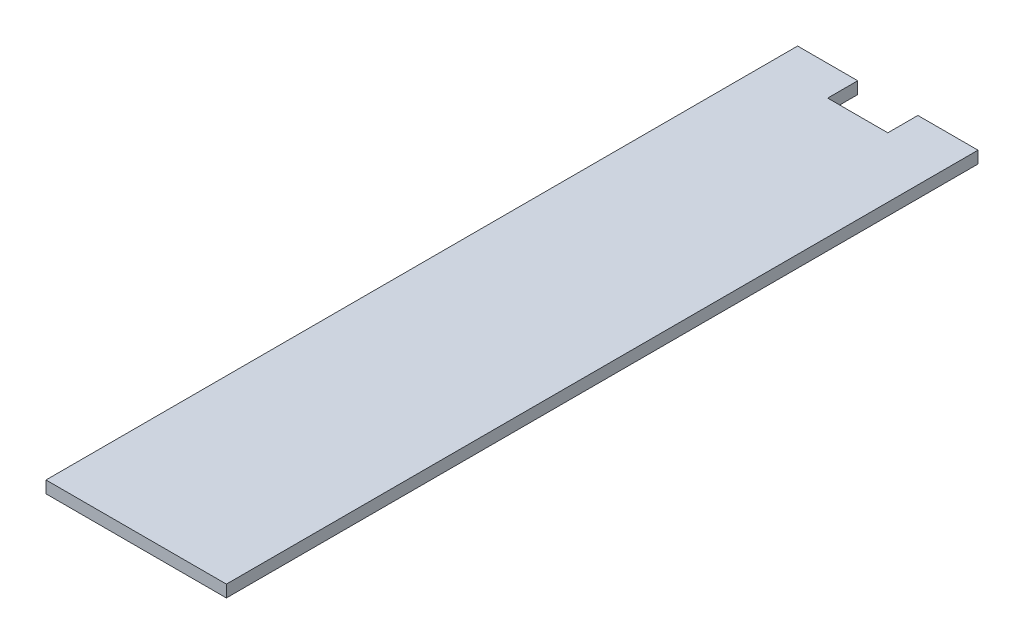
ISO-10303-21;
HEADER;
FILE_DESCRIPTION(('STEP AP214'),'2;1');
FILE_NAME('part.step','',(''),(''),'','','');
FILE_SCHEMA(('AUTOMOTIVE_DESIGN { 1 0 10303 214 1 1 1 1 }'));
ENDSEC;
DATA;
#1=APPLICATION_CONTEXT('core data for automotive mechanical design processes');
#2=APPLICATION_PROTOCOL_DEFINITION('international standard','automotive_design',2000,#1);
#3=PRODUCT_CONTEXT('',#1,'mechanical');
#4=PRODUCT('Part','Part','',(#3));
#5=PRODUCT_RELATED_PRODUCT_CATEGORY('part','',(#4));
#6=PRODUCT_DEFINITION_FORMATION('','',#4);
#7=PRODUCT_DEFINITION_CONTEXT('part definition',#1,'design');
#8=PRODUCT_DEFINITION('design','',#6,#7);
#9=PRODUCT_DEFINITION_SHAPE('','',#8);
#10=(LENGTH_UNIT() NAMED_UNIT(*) SI_UNIT(.MILLI.,.METRE.));
#11=(NAMED_UNIT(*) PLANE_ANGLE_UNIT() SI_UNIT($,.RADIAN.));
#12=(NAMED_UNIT(*) SI_UNIT($,.STERADIAN.) SOLID_ANGLE_UNIT());
#13=UNCERTAINTY_MEASURE_WITH_UNIT(LENGTH_MEASURE(1.E-05),#10,'distance_accuracy_value','');
#14=(GEOMETRIC_REPRESENTATION_CONTEXT(3) GLOBAL_UNCERTAINTY_ASSIGNED_CONTEXT((#13)) GLOBAL_UNIT_ASSIGNED_CONTEXT((#10,
#11,#12)) REPRESENTATION_CONTEXT('',''));
#15=CARTESIAN_POINT('',(0.,0.,0.));
#16=DIRECTION('',(0.,0.,1.));
#17=DIRECTION('',(1.,0.,0.));
#18=AXIS2_PLACEMENT_3D('',#15,#16,#17);
#19=CARTESIAN_POINT('',(0.,2.54,0.));
#20=DIRECTION('',(0.,0.,-1.));
#21=DIRECTION('',(-1.,0.,0.));
#22=AXIS2_PLACEMENT_3D('',#19,#20,#21);
#23=PLANE('',#22);
#24=DIRECTION('',(1.,0.,0.));
#25=VECTOR('',#24,1.);
#26=CARTESIAN_POINT('',(0.,0.,0.));
#27=LINE('',#26,#25);
#28=CARTESIAN_POINT('',(0.,0.,0.));
#29=VERTEX_POINT('',#28);
#30=CARTESIAN_POINT('',(38.1,0.,0.));
#31=VERTEX_POINT('',#30);
#32=EDGE_CURVE('E132',#29,#31,#27,.T.);
#33=ORIENTED_EDGE('',*,*,#32,.T.);
#34=DIRECTION('',(0.,-1.,0.));
#35=VECTOR('',#34,1.);
#36=CARTESIAN_POINT('',(38.1,2.54,0.));
#37=LINE('',#36,#35);
#38=CARTESIAN_POINT('',(38.1,2.54,0.));
#39=VERTEX_POINT('',#38);
#40=EDGE_CURVE('E11',#39,#31,#37,.T.);
#41=ORIENTED_EDGE('',*,*,#40,.F.);
#42=DIRECTION('',(1.,0.,0.));
#43=VECTOR('',#42,1.);
#44=CARTESIAN_POINT('',(0.,2.54,0.));
#45=LINE('',#44,#43);
#46=CARTESIAN_POINT('',(0.,2.54,0.));
#47=VERTEX_POINT('',#46);
#48=EDGE_CURVE('E151',#47,#39,#45,.T.);
#49=ORIENTED_EDGE('',*,*,#48,.F.);
#50=DIRECTION('',(0.,-1.,0.));
#51=VECTOR('',#50,1.);
#52=CARTESIAN_POINT('',(0.,2.54,0.));
#53=LINE('',#52,#51);
#54=EDGE_CURVE('E51',#47,#29,#53,.T.);
#55=ORIENTED_EDGE('',*,*,#54,.T.);
#56=EDGE_LOOP('',(#33,#41,#49,#55));
#57=FACE_BOUND('',#56,.T.);
#58=ADVANCED_FACE('F35',(#57),#23,.F.);
#59=CARTESIAN_POINT('',(38.1,2.54,0.));
#60=DIRECTION('',(-1.,0.,0.));
#61=DIRECTION('',(0.,0.,1.));
#62=AXIS2_PLACEMENT_3D('',#59,#60,#61);
#63=PLANE('',#62);
#64=DIRECTION('',(0.,0.,-1.));
#65=VECTOR('',#64,1.);
#66=CARTESIAN_POINT('',(38.1,0.,0.));
#67=LINE('',#66,#65);
#68=CARTESIAN_POINT('',(38.1,0.,-158.75));
#69=VERTEX_POINT('',#68);
#70=EDGE_CURVE('E134',#31,#69,#67,.T.);
#71=ORIENTED_EDGE('',*,*,#70,.T.);
#72=DIRECTION('',(0.,-1.,0.));
#73=VECTOR('',#72,1.);
#74=CARTESIAN_POINT('',(38.1,2.54,-158.75));
#75=LINE('',#74,#73);
#76=CARTESIAN_POINT('',(38.1,2.54,-158.75));
#77=VERTEX_POINT('',#76);
#78=EDGE_CURVE('E43',#77,#69,#75,.T.);
#79=ORIENTED_EDGE('',*,*,#78,.F.);
#80=DIRECTION('',(0.,0.,-1.));
#81=VECTOR('',#80,1.);
#82=CARTESIAN_POINT('',(38.1,2.54,0.));
#83=LINE('',#82,#81);
#84=EDGE_CURVE('E89',#39,#77,#83,.T.);
#85=ORIENTED_EDGE('',*,*,#84,.F.);
#86=ORIENTED_EDGE('',*,*,#40,.T.);
#87=EDGE_LOOP('',(#71,#79,#85,#86));
#88=FACE_BOUND('',#87,.T.);
#89=ADVANCED_FACE('F178',(#88),#63,.F.);
#90=CARTESIAN_POINT('',(0.,2.54,-158.75));
#91=DIRECTION('',(0.,0.,1.));
#92=DIRECTION('',(1.,0.,0.));
#93=AXIS2_PLACEMENT_3D('',#90,#91,#92);
#94=PLANE('',#93);
#95=DIRECTION('',(-1.,0.,0.));
#96=VECTOR('',#95,1.);
#97=CARTESIAN_POINT('',(0.,0.,-158.75));
#98=LINE('',#97,#96);
#99=CARTESIAN_POINT('',(25.4,0.,-158.75));
#100=VERTEX_POINT('',#99);
#101=EDGE_CURVE('E136',#69,#100,#98,.T.);
#102=ORIENTED_EDGE('',*,*,#101,.T.);
#103=DIRECTION('',(0.,-1.,0.));
#104=VECTOR('',#103,1.);
#105=CARTESIAN_POINT('',(25.4,2.54,-158.75));
#106=LINE('',#105,#104);
#107=CARTESIAN_POINT('',(25.4,2.54,-158.75));
#108=VERTEX_POINT('',#107);
#109=EDGE_CURVE('E157',#108,#100,#106,.T.);
#110=ORIENTED_EDGE('',*,*,#109,.F.);
#111=DIRECTION('',(-1.,0.,0.));
#112=VECTOR('',#111,1.);
#113=CARTESIAN_POINT('',(0.,2.54,-158.75));
#114=LINE('',#113,#112);
#115=EDGE_CURVE('E164',#77,#108,#114,.T.);
#116=ORIENTED_EDGE('',*,*,#115,.F.);
#117=ORIENTED_EDGE('',*,*,#78,.T.);
#118=EDGE_LOOP('',(#102,#110,#116,#117));
#119=FACE_BOUND('',#118,.T.);
#120=ADVANCED_FACE('F162',(#119),#94,.F.);
#121=CARTESIAN_POINT('',(25.4,2.54,0.));
#122=DIRECTION('',(-1.,0.,0.));
#123=DIRECTION('',(0.,0.,1.));
#124=AXIS2_PLACEMENT_3D('',#121,#122,#123);
#125=PLANE('',#124);
#126=DIRECTION('',(0.,0.,-1.));
#127=VECTOR('',#126,1.);
#128=CARTESIAN_POINT('',(25.4,0.,0.));
#129=LINE('',#128,#127);
#130=CARTESIAN_POINT('',(25.4,0.,-152.4));
#131=VERTEX_POINT('',#130);
#132=EDGE_CURVE('E139',#131,#100,#129,.T.);
#133=ORIENTED_EDGE('',*,*,#132,.F.);
#134=DIRECTION('',(0.,-1.,0.));
#135=VECTOR('',#134,1.);
#136=CARTESIAN_POINT('',(25.4,2.54,-152.4));
#137=LINE('',#136,#135);
#138=CARTESIAN_POINT('',(25.4,2.54,-152.4));
#139=VERTEX_POINT('',#138);
#140=EDGE_CURVE('E155',#139,#131,#137,.T.);
#141=ORIENTED_EDGE('',*,*,#140,.F.);
#142=DIRECTION('',(0.,0.,-1.));
#143=VECTOR('',#142,1.);
#144=CARTESIAN_POINT('',(25.4,2.54,0.));
#145=LINE('',#144,#143);
#146=EDGE_CURVE('E172',#139,#108,#145,.T.);
#147=ORIENTED_EDGE('',*,*,#146,.T.);
#148=ORIENTED_EDGE('',*,*,#109,.T.);
#149=EDGE_LOOP('',(#133,#141,#147,#148));
#150=FACE_BOUND('',#149,.T.);
#151=ADVANCED_FACE('F170',(#150),#125,.T.);
#152=CARTESIAN_POINT('',(0.,2.54,-152.4));
#153=DIRECTION('',(0.,0.,-1.));
#154=DIRECTION('',(-1.,0.,0.));
#155=AXIS2_PLACEMENT_3D('',#152,#153,#154);
#156=PLANE('',#155);
#157=DIRECTION('',(1.,0.,0.));
#158=VECTOR('',#157,1.);
#159=CARTESIAN_POINT('',(0.,0.,-152.4));
#160=LINE('',#159,#158);
#161=CARTESIAN_POINT('',(12.7,0.,-152.4));
#162=VERTEX_POINT('',#161);
#163=EDGE_CURVE('E142',#162,#131,#160,.T.);
#164=ORIENTED_EDGE('',*,*,#163,.F.);
#165=DIRECTION('',(0.,-1.,0.));
#166=VECTOR('',#165,1.);
#167=CARTESIAN_POINT('',(12.7,2.54,-152.4));
#168=LINE('',#167,#166);
#169=CARTESIAN_POINT('',(12.7,2.54,-152.4));
#170=VERTEX_POINT('',#169);
#171=EDGE_CURVE('E124',#170,#162,#168,.T.);
#172=ORIENTED_EDGE('',*,*,#171,.F.);
#173=DIRECTION('',(1.,0.,0.));
#174=VECTOR('',#173,1.);
#175=CARTESIAN_POINT('',(0.,2.54,-152.4));
#176=LINE('',#175,#174);
#177=EDGE_CURVE('E114',#170,#139,#176,.T.);
#178=ORIENTED_EDGE('',*,*,#177,.T.);
#179=ORIENTED_EDGE('',*,*,#140,.T.);
#180=EDGE_LOOP('',(#164,#172,#178,#179));
#181=FACE_BOUND('',#180,.T.);
#182=ADVANCED_FACE('F188',(#181),#156,.T.);
#183=CARTESIAN_POINT('',(12.7,2.54,0.));
#184=DIRECTION('',(-1.,0.,0.));
#185=DIRECTION('',(0.,0.,1.));
#186=AXIS2_PLACEMENT_3D('',#183,#184,#185);
#187=PLANE('',#186);
#188=DIRECTION('',(0.,0.,-1.));
#189=VECTOR('',#188,1.);
#190=CARTESIAN_POINT('',(12.7,0.,0.));
#191=LINE('',#190,#189);
#192=CARTESIAN_POINT('',(12.7,0.,-158.75));
#193=VERTEX_POINT('',#192);
#194=EDGE_CURVE('E121',#162,#193,#191,.T.);
#195=ORIENTED_EDGE('',*,*,#194,.T.);
#196=DIRECTION('',(0.,-1.,0.));
#197=VECTOR('',#196,1.);
#198=CARTESIAN_POINT('',(12.7,2.54,-158.75));
#199=LINE('',#198,#197);
#200=CARTESIAN_POINT('',(12.7,2.54,-158.75));
#201=VERTEX_POINT('',#200);
#202=EDGE_CURVE('E118',#201,#193,#199,.T.);
#203=ORIENTED_EDGE('',*,*,#202,.F.);
#204=DIRECTION('',(0.,0.,-1.));
#205=VECTOR('',#204,1.);
#206=CARTESIAN_POINT('',(12.7,2.54,0.));
#207=LINE('',#206,#205);
#208=EDGE_CURVE('E106',#170,#201,#207,.T.);
#209=ORIENTED_EDGE('',*,*,#208,.F.);
#210=ORIENTED_EDGE('',*,*,#171,.T.);
#211=EDGE_LOOP('',(#195,#203,#209,#210));
#212=FACE_BOUND('',#211,.T.);
#213=ADVANCED_FACE('F119',(#212),#187,.F.);
#214=CARTESIAN_POINT('',(0.,2.54,-158.75));
#215=DIRECTION('',(0.,0.,-1.));
#216=DIRECTION('',(-1.,0.,0.));
#217=AXIS2_PLACEMENT_3D('',#214,#215,#216);
#218=PLANE('',#217);
#219=DIRECTION('',(1.,0.,0.));
#220=VECTOR('',#219,1.);
#221=CARTESIAN_POINT('',(0.,0.,-158.75));
#222=LINE('',#221,#220);
#223=CARTESIAN_POINT('',(0.,0.,-158.75));
#224=VERTEX_POINT('',#223);
#225=EDGE_CURVE('E146',#224,#193,#222,.T.);
#226=ORIENTED_EDGE('',*,*,#225,.F.);
#227=DIRECTION('',(0.,-1.,0.));
#228=VECTOR('',#227,1.);
#229=CARTESIAN_POINT('',(0.,2.54,-158.75));
#230=LINE('',#229,#228);
#231=CARTESIAN_POINT('',(0.,2.54,-158.75));
#232=VERTEX_POINT('',#231);
#233=EDGE_CURVE('E77',#232,#224,#230,.T.);
#234=ORIENTED_EDGE('',*,*,#233,.F.);
#235=DIRECTION('',(1.,0.,0.));
#236=VECTOR('',#235,1.);
#237=CARTESIAN_POINT('',(0.,2.54,-158.75));
#238=LINE('',#237,#236);
#239=EDGE_CURVE('E111',#232,#201,#238,.T.);
#240=ORIENTED_EDGE('',*,*,#239,.T.);
#241=ORIENTED_EDGE('',*,*,#202,.T.);
#242=EDGE_LOOP('',(#226,#234,#240,#241));
#243=FACE_BOUND('',#242,.T.);
#244=ADVANCED_FACE('F126',(#243),#218,.T.);
#245=CARTESIAN_POINT('',(0.,2.54,0.));
#246=DIRECTION('',(-1.,0.,0.));
#247=DIRECTION('',(0.,0.,1.));
#248=AXIS2_PLACEMENT_3D('',#245,#246,#247);
#249=PLANE('',#248);
#250=DIRECTION('',(0.,0.,-1.));
#251=VECTOR('',#250,1.);
#252=CARTESIAN_POINT('',(0.,0.,0.));
#253=LINE('',#252,#251);
#254=EDGE_CURVE('E148',#29,#224,#253,.T.);
#255=ORIENTED_EDGE('',*,*,#254,.F.);
#256=ORIENTED_EDGE('',*,*,#54,.F.);
#257=DIRECTION('',(0.,0.,-1.));
#258=VECTOR('',#257,1.);
#259=CARTESIAN_POINT('',(0.,2.54,0.));
#260=LINE('',#259,#258);
#261=EDGE_CURVE('E127',#47,#232,#260,.T.);
#262=ORIENTED_EDGE('',*,*,#261,.T.);
#263=ORIENTED_EDGE('',*,*,#233,.T.);
#264=EDGE_LOOP('',(#255,#256,#262,#263));
#265=FACE_BOUND('',#264,.T.);
#266=ADVANCED_FACE('F196',(#265),#249,.T.);
#267=CARTESIAN_POINT('',(0.,2.54,0.));
#268=DIRECTION('',(0.,1.,0.));
#269=DIRECTION('',(0.,0.,1.));
#270=AXIS2_PLACEMENT_3D('',#267,#268,#269);
#271=PLANE('',#270);
#272=ORIENTED_EDGE('',*,*,#48,.T.);
#273=ORIENTED_EDGE('',*,*,#84,.T.);
#274=ORIENTED_EDGE('',*,*,#115,.T.);
#275=ORIENTED_EDGE('',*,*,#146,.F.);
#276=ORIENTED_EDGE('',*,*,#177,.F.);
#277=ORIENTED_EDGE('',*,*,#208,.T.);
#278=ORIENTED_EDGE('',*,*,#239,.F.);
#279=ORIENTED_EDGE('',*,*,#261,.F.);
#280=EDGE_LOOP('',(#272,#273,#274,#275,#276,#277,#278,#279));
#281=FACE_BOUND('',#280,.T.);
#282=ADVANCED_FACE('F108',(#281),#271,.T.);
#283=CARTESIAN_POINT('',(0.,0.,0.));
#284=DIRECTION('',(0.,1.,0.));
#285=DIRECTION('',(0.,0.,1.));
#286=AXIS2_PLACEMENT_3D('',#283,#284,#285);
#287=PLANE('',#286);
#288=ORIENTED_EDGE('',*,*,#32,.F.);
#289=ORIENTED_EDGE('',*,*,#254,.T.);
#290=ORIENTED_EDGE('',*,*,#225,.T.);
#291=ORIENTED_EDGE('',*,*,#194,.F.);
#292=ORIENTED_EDGE('',*,*,#163,.T.);
#293=ORIENTED_EDGE('',*,*,#132,.T.);
#294=ORIENTED_EDGE('',*,*,#101,.F.);
#295=ORIENTED_EDGE('',*,*,#70,.F.);
#296=EDGE_LOOP('',(#288,#289,#290,#291,#292,#293,#294,#295));
#297=FACE_BOUND('',#296,.T.);
#298=ADVANCED_FACE('F166',(#297),#287,.F.);
#299=CLOSED_SHELL('',(#58,#89,#120,#151,#182,#213,#244,#266,#282,#298));
#300=MANIFOLD_SOLID_BREP('B2',#299);
#301=ADVANCED_BREP_SHAPE_REPRESENTATION('',(#18,#300),#14);
#302=SHAPE_DEFINITION_REPRESENTATION(#9,#301);
ENDSEC;
END-ISO-10303-21;
